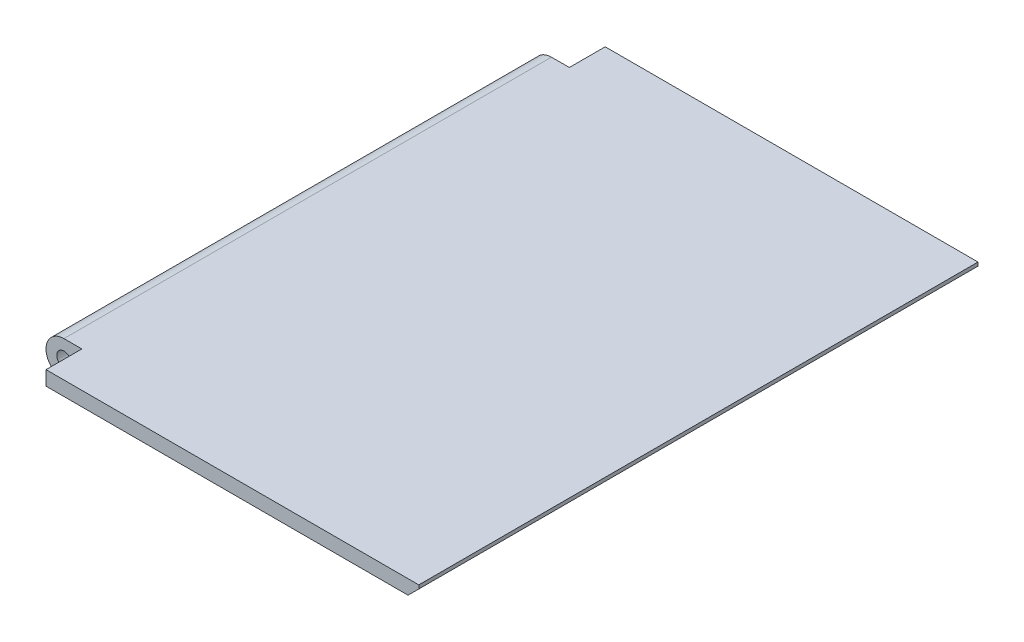
ISO-10303-21;
HEADER;
FILE_DESCRIPTION(('STEP AP214'),'2;1');
FILE_NAME('part.step','',(''),(''),'','','');
FILE_SCHEMA(('AUTOMOTIVE_DESIGN { 1 0 10303 214 1 1 1 1 }'));
ENDSEC;
DATA;
#1=APPLICATION_CONTEXT('core data for automotive mechanical design processes');
#2=APPLICATION_PROTOCOL_DEFINITION('international standard','automotive_design',2000,#1);
#3=PRODUCT_CONTEXT('',#1,'mechanical');
#4=PRODUCT('Part','Part','',(#3));
#5=PRODUCT_RELATED_PRODUCT_CATEGORY('part','',(#4));
#6=PRODUCT_DEFINITION_FORMATION('','',#4);
#7=PRODUCT_DEFINITION_CONTEXT('part definition',#1,'design');
#8=PRODUCT_DEFINITION('design','',#6,#7);
#9=PRODUCT_DEFINITION_SHAPE('','',#8);
#10=(LENGTH_UNIT() NAMED_UNIT(*) SI_UNIT(.MILLI.,.METRE.));
#11=(NAMED_UNIT(*) PLANE_ANGLE_UNIT() SI_UNIT($,.RADIAN.));
#12=(NAMED_UNIT(*) SI_UNIT($,.STERADIAN.) SOLID_ANGLE_UNIT());
#13=UNCERTAINTY_MEASURE_WITH_UNIT(LENGTH_MEASURE(1.E-05),#10,'distance_accuracy_value','');
#14=(GEOMETRIC_REPRESENTATION_CONTEXT(3) GLOBAL_UNCERTAINTY_ASSIGNED_CONTEXT((#13)) GLOBAL_UNIT_ASSIGNED_CONTEXT((#10,
#11,#12)) REPRESENTATION_CONTEXT('',''));
#15=CARTESIAN_POINT('',(0.,0.,0.));
#16=DIRECTION('',(0.,0.,1.));
#17=DIRECTION('',(1.,0.,0.));
#18=AXIS2_PLACEMENT_3D('',#15,#16,#17);
#19=CARTESIAN_POINT('',(4.89897948556636,1.,136.));
#20=DIRECTION('',(0.,1.,0.));
#21=DIRECTION('',(0.,0.,1.));
#22=AXIS2_PLACEMENT_3D('',#19,#20,#21);
#23=PLANE('',#22);
#24=DIRECTION('',(0.,0.,1.));
#25=VECTOR('',#24,1.);
#26=CARTESIAN_POINT('',(106.,1.,-10.));
#27=LINE('',#26,#25);
#28=CARTESIAN_POINT('',(106.,1.,-10.));
#29=VERTEX_POINT('',#28);
#30=CARTESIAN_POINT('',(106.,1.,146.));
#31=VERTEX_POINT('',#30);
#32=EDGE_CURVE('E51',#29,#31,#27,.T.);
#33=ORIENTED_EDGE('',*,*,#32,.T.);
#34=DIRECTION('',(1.,0.,0.));
#35=VECTOR('',#34,1.);
#36=CARTESIAN_POINT('',(0.,1.,146.));
#37=LINE('',#36,#35);
#38=CARTESIAN_POINT('',(5.,1.,146.));
#39=VERTEX_POINT('',#38);
#40=EDGE_CURVE('E145',#39,#31,#37,.T.);
#41=ORIENTED_EDGE('',*,*,#40,.F.);
#42=DIRECTION('',(0.,0.,-1.));
#43=VECTOR('',#42,1.);
#44=CARTESIAN_POINT('',(5.,1.,146.));
#45=LINE('',#44,#43);
#46=CARTESIAN_POINT('',(5.,1.,136.));
#47=VERTEX_POINT('',#46);
#48=EDGE_CURVE('E155',#39,#47,#45,.T.);
#49=ORIENTED_EDGE('',*,*,#48,.T.);
#50=DIRECTION('',(1.,0.,0.));
#51=VECTOR('',#50,1.);
#52=CARTESIAN_POINT('',(4.89897948556636,1.,136.));
#53=LINE('',#52,#51);
#54=CARTESIAN_POINT('',(4.89897948556636,1.,136.));
#55=VERTEX_POINT('',#54);
#56=EDGE_CURVE('E167',#55,#47,#53,.T.);
#57=ORIENTED_EDGE('',*,*,#56,.F.);
#58=DIRECTION('',(0.,0.,-1.));
#59=VECTOR('',#58,1.);
#60=CARTESIAN_POINT('',(4.89897948556636,1.,136.));
#61=LINE('',#60,#59);
#62=CARTESIAN_POINT('',(4.89897948556636,1.,0.));
#63=VERTEX_POINT('',#62);
#64=EDGE_CURVE('E11',#55,#63,#61,.T.);
#65=ORIENTED_EDGE('',*,*,#64,.T.);
#66=DIRECTION('',(1.,0.,0.));
#67=VECTOR('',#66,1.);
#68=CARTESIAN_POINT('',(4.89897948556636,1.,0.));
#69=LINE('',#68,#67);
#70=CARTESIAN_POINT('',(5.,1.,0.));
#71=VERTEX_POINT('',#70);
#72=EDGE_CURVE('E176',#63,#71,#69,.T.);
#73=ORIENTED_EDGE('',*,*,#72,.T.);
#74=DIRECTION('',(0.,0.,1.));
#75=VECTOR('',#74,1.);
#76=CARTESIAN_POINT('',(5.,1.,-10.));
#77=LINE('',#76,#75);
#78=CARTESIAN_POINT('',(5.,1.,-10.));
#79=VERTEX_POINT('',#78);
#80=EDGE_CURVE('E59',#79,#71,#77,.T.);
#81=ORIENTED_EDGE('',*,*,#80,.F.);
#82=DIRECTION('',(-1.,0.,0.));
#83=VECTOR('',#82,1.);
#84=CARTESIAN_POINT('',(0.,1.,-10.));
#85=LINE('',#84,#83);
#86=EDGE_CURVE('E129',#29,#79,#85,.T.);
#87=ORIENTED_EDGE('',*,*,#86,.F.);
#88=EDGE_LOOP('',(#33,#41,#49,#57,#65,#73,#81,#87));
#89=FACE_BOUND('',#88,.T.);
#90=ADVANCED_FACE('F36',(#89),#23,.F.);
#91=CARTESIAN_POINT('',(109.,5.,136.));
#92=DIRECTION('',(-1.,0.,0.));
#93=DIRECTION('',(0.,0.,1.));
#94=AXIS2_PLACEMENT_3D('',#91,#92,#93);
#95=PLANE('',#94);
#96=DIRECTION('',(0.,0.,1.));
#97=VECTOR('',#96,1.);
#98=CARTESIAN_POINT('',(109.,4.00000000000001,-10.));
#99=LINE('',#98,#97);
#100=CARTESIAN_POINT('',(109.,4.00000000000001,-10.));
#101=VERTEX_POINT('',#100);
#102=CARTESIAN_POINT('',(109.,4.00000000000001,146.));
#103=VERTEX_POINT('',#102);
#104=EDGE_CURVE('E109',#101,#103,#99,.T.);
#105=ORIENTED_EDGE('',*,*,#104,.F.);
#106=DIRECTION('',(0.,-1.,0.));
#107=VECTOR('',#106,1.);
#108=CARTESIAN_POINT('',(109.,0.,-10.));
#109=LINE('',#108,#107);
#110=CARTESIAN_POINT('',(109.,5.,-10.));
#111=VERTEX_POINT('',#110);
#112=EDGE_CURVE('E121',#111,#101,#109,.T.);
#113=ORIENTED_EDGE('',*,*,#112,.F.);
#114=DIRECTION('',(0.,0.,-1.));
#115=VECTOR('',#114,1.);
#116=CARTESIAN_POINT('',(109.,5.,136.));
#117=LINE('',#116,#115);
#118=CARTESIAN_POINT('',(109.,5.,146.));
#119=VERTEX_POINT('',#118);
#120=EDGE_CURVE('E44',#119,#111,#117,.T.);
#121=ORIENTED_EDGE('',*,*,#120,.F.);
#122=DIRECTION('',(0.,1.,0.));
#123=VECTOR('',#122,1.);
#124=CARTESIAN_POINT('',(109.,0.,146.));
#125=LINE('',#124,#123);
#126=EDGE_CURVE('E122',#103,#119,#125,.T.);
#127=ORIENTED_EDGE('',*,*,#126,.F.);
#128=EDGE_LOOP('',(#105,#113,#121,#127));
#129=FACE_BOUND('',#128,.T.);
#130=ADVANCED_FACE('F119',(#129),#95,.F.);
#131=CARTESIAN_POINT('',(0.,0.,146.));
#132=DIRECTION('',(0.,0.,1.));
#133=DIRECTION('',(1.,0.,0.));
#134=AXIS2_PLACEMENT_3D('',#131,#132,#133);
#135=PLANE('',#134);
#136=ORIENTED_EDGE('',*,*,#40,.T.);
#137=DIRECTION('',(0.707106781186547,0.707106781186548,0.));
#138=VECTOR('',#137,1.);
#139=CARTESIAN_POINT('',(106.,1.,146.));
#140=LINE('',#139,#138);
#141=EDGE_CURVE('E114',#31,#103,#140,.T.);
#142=ORIENTED_EDGE('',*,*,#141,.T.);
#143=ORIENTED_EDGE('',*,*,#126,.T.);
#144=DIRECTION('',(-1.,0.,0.));
#145=VECTOR('',#144,1.);
#146=CARTESIAN_POINT('',(0.,5.,146.));
#147=LINE('',#146,#145);
#148=CARTESIAN_POINT('',(5.,5.,146.));
#149=VERTEX_POINT('',#148);
#150=EDGE_CURVE('E149',#119,#149,#147,.T.);
#151=ORIENTED_EDGE('',*,*,#150,.T.);
#152=DIRECTION('',(0.,1.,0.));
#153=VECTOR('',#152,1.);
#154=CARTESIAN_POINT('',(5.,0.,146.));
#155=LINE('',#154,#153);
#156=EDGE_CURVE('E142',#39,#149,#155,.T.);
#157=ORIENTED_EDGE('',*,*,#156,.F.);
#158=EDGE_LOOP('',(#136,#142,#143,#151,#157));
#159=FACE_BOUND('',#158,.T.);
#160=ADVANCED_FACE('F188',(#159),#135,.T.);
#161=CARTESIAN_POINT('',(0.,0.,-10.));
#162=DIRECTION('',(0.,0.,-1.));
#163=DIRECTION('',(-1.,0.,0.));
#164=AXIS2_PLACEMENT_3D('',#161,#162,#163);
#165=PLANE('',#164);
#166=ORIENTED_EDGE('',*,*,#112,.T.);
#167=DIRECTION('',(0.707106781186547,0.707106781186548,0.));
#168=VECTOR('',#167,1.);
#169=CARTESIAN_POINT('',(106.,1.,-10.));
#170=LINE('',#169,#168);
#171=EDGE_CURVE('E106',#29,#101,#170,.T.);
#172=ORIENTED_EDGE('',*,*,#171,.F.);
#173=ORIENTED_EDGE('',*,*,#86,.T.);
#174=DIRECTION('',(0.,-1.,0.));
#175=VECTOR('',#174,1.);
#176=CARTESIAN_POINT('',(5.,0.,-10.));
#177=LINE('',#176,#175);
#178=CARTESIAN_POINT('',(5.,5.,-10.));
#179=VERTEX_POINT('',#178);
#180=EDGE_CURVE('E132',#179,#79,#177,.T.);
#181=ORIENTED_EDGE('',*,*,#180,.F.);
#182=DIRECTION('',(1.,0.,0.));
#183=VECTOR('',#182,1.);
#184=CARTESIAN_POINT('',(0.,5.,-10.));
#185=LINE('',#184,#183);
#186=EDGE_CURVE('E128',#179,#111,#185,.T.);
#187=ORIENTED_EDGE('',*,*,#186,.T.);
#188=EDGE_LOOP('',(#166,#172,#173,#181,#187));
#189=FACE_BOUND('',#188,.T.);
#190=ADVANCED_FACE('F125',(#189),#165,.T.);
#191=CARTESIAN_POINT('',(0.,0.,136.));
#192=DIRECTION('',(0.,0.,1.));
#193=DIRECTION('',(1.,0.,0.));
#194=AXIS2_PLACEMENT_3D('',#191,#192,#193);
#195=PLANE('',#194);
#196=CARTESIAN_POINT('',(0.,0.,136.));
#197=DIRECTION('',(0.,0.,1.));
#198=DIRECTION('',(1.,0.,0.));
#199=AXIS2_PLACEMENT_3D('',#196,#197,#198);
#200=CIRCLE('',#199,2.);
#201=CARTESIAN_POINT('',(2.,0.,136.));
#202=VERTEX_POINT('',#201);
#203=EDGE_CURVE('E158',#202,#202,#200,.T.);
#204=ORIENTED_EDGE('',*,*,#203,.F.);
#205=EDGE_LOOP('',(#204));
#206=FACE_BOUND('',#205,.T.);
#207=ORIENTED_EDGE('',*,*,#56,.T.);
#208=DIRECTION('',(0.,1.,0.));
#209=VECTOR('',#208,1.);
#210=CARTESIAN_POINT('',(5.,0.,136.));
#211=LINE('',#210,#209);
#212=CARTESIAN_POINT('',(5.,5.,136.));
#213=VERTEX_POINT('',#212);
#214=EDGE_CURVE('E141',#47,#213,#211,.T.);
#215=ORIENTED_EDGE('',*,*,#214,.T.);
#216=DIRECTION('',(-1.,0.,0.));
#217=VECTOR('',#216,1.);
#218=CARTESIAN_POINT('',(0.,5.,136.));
#219=LINE('',#218,#217);
#220=CARTESIAN_POINT('',(0.,5.,136.));
#221=VERTEX_POINT('',#220);
#222=EDGE_CURVE('E171',#213,#221,#219,.T.);
#223=ORIENTED_EDGE('',*,*,#222,.T.);
#224=CARTESIAN_POINT('',(0.,0.,136.));
#225=DIRECTION('',(0.,0.,1.));
#226=DIRECTION('',(1.,0.,0.));
#227=AXIS2_PLACEMENT_3D('',#224,#225,#226);
#228=CIRCLE('',#227,5.);
#229=EDGE_CURVE('E164',#221,#55,#228,.T.);
#230=ORIENTED_EDGE('',*,*,#229,.T.);
#231=EDGE_LOOP('',(#207,#215,#223,#230));
#232=FACE_BOUND('',#231,.T.);
#233=ADVANCED_FACE('F204',(#206,#232),#195,.T.);
#234=CARTESIAN_POINT('',(0.,0.,0.));
#235=DIRECTION('',(0.,0.,1.));
#236=DIRECTION('',(1.,0.,0.));
#237=AXIS2_PLACEMENT_3D('',#234,#235,#236);
#238=PLANE('',#237);
#239=DIRECTION('',(-1.,0.,0.));
#240=VECTOR('',#239,1.);
#241=CARTESIAN_POINT('',(0.,5.,0.));
#242=LINE('',#241,#240);
#243=CARTESIAN_POINT('',(5.,5.,0.));
#244=VERTEX_POINT('',#243);
#245=CARTESIAN_POINT('',(0.,5.,0.));
#246=VERTEX_POINT('',#245);
#247=EDGE_CURVE('E168',#244,#246,#242,.T.);
#248=ORIENTED_EDGE('',*,*,#247,.F.);
#249=DIRECTION('',(0.,-1.,0.));
#250=VECTOR('',#249,1.);
#251=CARTESIAN_POINT('',(5.,0.,0.));
#252=LINE('',#251,#250);
#253=EDGE_CURVE('E136',#244,#71,#252,.T.);
#254=ORIENTED_EDGE('',*,*,#253,.T.);
#255=ORIENTED_EDGE('',*,*,#72,.F.);
#256=CARTESIAN_POINT('',(0.,0.,0.));
#257=DIRECTION('',(0.,0.,1.));
#258=DIRECTION('',(1.,0.,0.));
#259=AXIS2_PLACEMENT_3D('',#256,#257,#258);
#260=CIRCLE('',#259,5.);
#261=EDGE_CURVE('E161',#246,#63,#260,.T.);
#262=ORIENTED_EDGE('',*,*,#261,.F.);
#263=EDGE_LOOP('',(#248,#254,#255,#262));
#264=FACE_BOUND('',#263,.T.);
#265=CARTESIAN_POINT('',(0.,0.,0.));
#266=DIRECTION('',(0.,0.,1.));
#267=DIRECTION('',(1.,0.,0.));
#268=AXIS2_PLACEMENT_3D('',#265,#266,#267);
#269=CIRCLE('',#268,2.);
#270=CARTESIAN_POINT('',(2.,0.,0.));
#271=VERTEX_POINT('',#270);
#272=EDGE_CURVE('E157',#271,#271,#269,.T.);
#273=ORIENTED_EDGE('',*,*,#272,.T.);
#274=EDGE_LOOP('',(#273));
#275=FACE_BOUND('',#274,.T.);
#276=ADVANCED_FACE('F198',(#264,#275),#238,.F.);
#277=CARTESIAN_POINT('',(0.,0.,136.));
#278=DIRECTION('',(0.,0.,-1.));
#279=DIRECTION('',(-1.,0.,0.));
#280=AXIS2_PLACEMENT_3D('',#277,#278,#279);
#281=CYLINDRICAL_SURFACE('',#280,5.);
#282=ORIENTED_EDGE('',*,*,#261,.T.);
#283=ORIENTED_EDGE('',*,*,#64,.F.);
#284=ORIENTED_EDGE('',*,*,#229,.F.);
#285=DIRECTION('',(0.,0.,-1.));
#286=VECTOR('',#285,1.);
#287=CARTESIAN_POINT('',(0.,5.,136.));
#288=LINE('',#287,#286);
#289=EDGE_CURVE('E173',#221,#246,#288,.T.);
#290=ORIENTED_EDGE('',*,*,#289,.T.);
#291=EDGE_LOOP('',(#282,#283,#284,#290));
#292=FACE_BOUND('',#291,.T.);
#293=ADVANCED_FACE('F38',(#292),#281,.T.);
#294=CARTESIAN_POINT('',(0.,5.,136.));
#295=DIRECTION('',(0.,-1.,0.));
#296=DIRECTION('',(0.,0.,-1.));
#297=AXIS2_PLACEMENT_3D('',#294,#295,#296);
#298=PLANE('',#297);
#299=ORIENTED_EDGE('',*,*,#120,.T.);
#300=ORIENTED_EDGE('',*,*,#186,.F.);
#301=DIRECTION('',(0.,0.,1.));
#302=VECTOR('',#301,1.);
#303=CARTESIAN_POINT('',(5.,5.,-10.));
#304=LINE('',#303,#302);
#305=EDGE_CURVE('E139',#179,#244,#304,.T.);
#306=ORIENTED_EDGE('',*,*,#305,.T.);
#307=ORIENTED_EDGE('',*,*,#247,.T.);
#308=ORIENTED_EDGE('',*,*,#289,.F.);
#309=ORIENTED_EDGE('',*,*,#222,.F.);
#310=DIRECTION('',(0.,0.,-1.));
#311=VECTOR('',#310,1.);
#312=CARTESIAN_POINT('',(5.,5.,146.));
#313=LINE('',#312,#311);
#314=EDGE_CURVE('E151',#149,#213,#313,.T.);
#315=ORIENTED_EDGE('',*,*,#314,.F.);
#316=ORIENTED_EDGE('',*,*,#150,.F.);
#317=EDGE_LOOP('',(#299,#300,#306,#307,#308,#309,#315,#316));
#318=FACE_BOUND('',#317,.T.);
#319=ADVANCED_FACE('F183',(#318),#298,.F.);
#320=CARTESIAN_POINT('',(0.,0.,136.));
#321=DIRECTION('',(0.,0.,-1.));
#322=DIRECTION('',(-1.,0.,0.));
#323=AXIS2_PLACEMENT_3D('',#320,#321,#322);
#324=CYLINDRICAL_SURFACE('',#323,2.);
#325=ORIENTED_EDGE('',*,*,#203,.T.);
#326=EDGE_LOOP('',(#325));
#327=FACE_BOUND('',#326,.T.);
#328=ORIENTED_EDGE('',*,*,#272,.F.);
#329=EDGE_LOOP('',(#328));
#330=FACE_BOUND('',#329,.T.);
#331=ADVANCED_FACE('F209',(#327,#330),#324,.F.);
#332=CARTESIAN_POINT('',(5.,0.,146.));
#333=DIRECTION('',(-1.,0.,0.));
#334=DIRECTION('',(0.,0.,1.));
#335=AXIS2_PLACEMENT_3D('',#332,#333,#334);
#336=PLANE('',#335);
#337=ORIENTED_EDGE('',*,*,#214,.F.);
#338=ORIENTED_EDGE('',*,*,#48,.F.);
#339=ORIENTED_EDGE('',*,*,#156,.T.);
#340=ORIENTED_EDGE('',*,*,#314,.T.);
#341=EDGE_LOOP('',(#337,#338,#339,#340));
#342=FACE_BOUND('',#341,.T.);
#343=ADVANCED_FACE('F207',(#342),#336,.T.);
#344=CARTESIAN_POINT('',(5.,0.,-10.));
#345=DIRECTION('',(-1.,0.,0.));
#346=DIRECTION('',(0.,-1.,0.));
#347=AXIS2_PLACEMENT_3D('',#344,#345,#346);
#348=PLANE('',#347);
#349=ORIENTED_EDGE('',*,*,#253,.F.);
#350=ORIENTED_EDGE('',*,*,#305,.F.);
#351=ORIENTED_EDGE('',*,*,#180,.T.);
#352=ORIENTED_EDGE('',*,*,#80,.T.);
#353=EDGE_LOOP('',(#349,#350,#351,#352));
#354=FACE_BOUND('',#353,.T.);
#355=ADVANCED_FACE('F192',(#354),#348,.T.);
#356=CARTESIAN_POINT('',(106.,1.,-10.));
#357=DIRECTION('',(0.707106781186548,-0.707106781186547,0.));
#358=DIRECTION('',(0.707106781186547,0.707106781186548,0.));
#359=AXIS2_PLACEMENT_3D('',#356,#357,#358);
#360=PLANE('',#359);
#361=ORIENTED_EDGE('',*,*,#141,.F.);
#362=ORIENTED_EDGE('',*,*,#32,.F.);
#363=ORIENTED_EDGE('',*,*,#171,.T.);
#364=ORIENTED_EDGE('',*,*,#104,.T.);
#365=EDGE_LOOP('',(#361,#362,#363,#364));
#366=FACE_BOUND('',#365,.T.);
#367=ADVANCED_FACE('F108',(#366),#360,.T.);
#368=CLOSED_SHELL('',(#90,#130,#160,#190,#233,#276,#293,#319,#331,#343,#355,#367));
#369=MANIFOLD_SOLID_BREP('B2',#368);
#370=ADVANCED_BREP_SHAPE_REPRESENTATION('',(#18,#369),#14);
#371=SHAPE_DEFINITION_REPRESENTATION(#9,#370);
ENDSEC;
END-ISO-10303-21;
